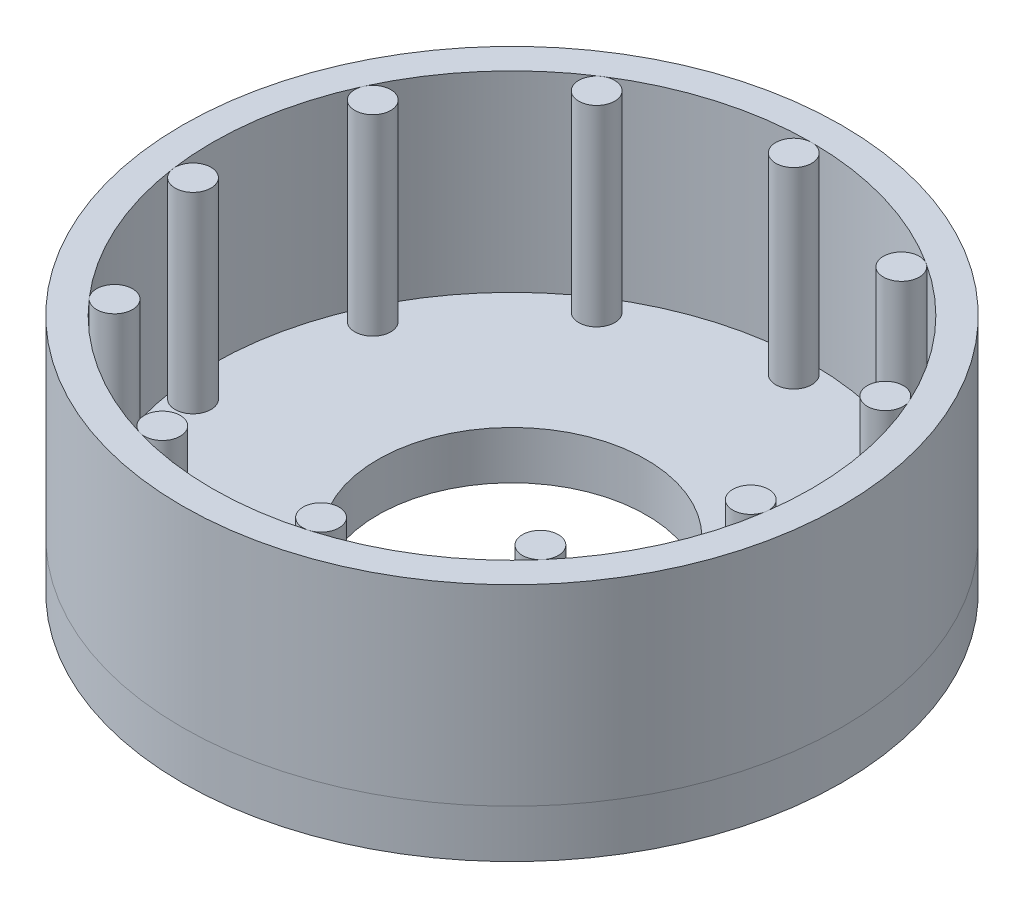
ISO-10303-21;
HEADER;
FILE_DESCRIPTION(('STEP AP214'),'2;1');
FILE_NAME('part.step','',(''),(''),'','','');
FILE_SCHEMA(('AUTOMOTIVE_DESIGN { 1 0 10303 214 1 1 1 1 }'));
ENDSEC;
DATA;
#1=APPLICATION_CONTEXT('core data for automotive mechanical design processes');
#2=APPLICATION_PROTOCOL_DEFINITION('international standard','automotive_design',2000,#1);
#3=PRODUCT_CONTEXT('',#1,'mechanical');
#4=PRODUCT('Part','Part','',(#3));
#5=PRODUCT_RELATED_PRODUCT_CATEGORY('part','',(#4));
#6=PRODUCT_DEFINITION_FORMATION('','',#4);
#7=PRODUCT_DEFINITION_CONTEXT('part definition',#1,'design');
#8=PRODUCT_DEFINITION('design','',#6,#7);
#9=PRODUCT_DEFINITION_SHAPE('','',#8);
#10=(LENGTH_UNIT() NAMED_UNIT(*) SI_UNIT(.MILLI.,.METRE.));
#11=(NAMED_UNIT(*) PLANE_ANGLE_UNIT() SI_UNIT($,.RADIAN.));
#12=(NAMED_UNIT(*) SI_UNIT($,.STERADIAN.) SOLID_ANGLE_UNIT());
#13=UNCERTAINTY_MEASURE_WITH_UNIT(LENGTH_MEASURE(1.E-05),#10,'distance_accuracy_value','');
#14=(GEOMETRIC_REPRESENTATION_CONTEXT(3) GLOBAL_UNCERTAINTY_ASSIGNED_CONTEXT((#13)) GLOBAL_UNIT_ASSIGNED_CONTEXT((#10,
#11,#12)) REPRESENTATION_CONTEXT('',''));
#15=CARTESIAN_POINT('',(0.,0.,0.));
#16=DIRECTION('',(0.,0.,1.));
#17=DIRECTION('',(1.,0.,0.));
#18=AXIS2_PLACEMENT_3D('',#15,#16,#17);
#19=CARTESIAN_POINT('',(0.,-4.,0.));
#20=DIRECTION('',(0.,1.,0.));
#21=DIRECTION('',(0.,0.,1.));
#22=AXIS2_PLACEMENT_3D('',#19,#20,#21);
#23=CYLINDRICAL_SURFACE('',#22,27.5);
#24=CARTESIAN_POINT('',(0.,-4.,0.));
#25=DIRECTION('',(0.,1.,0.));
#26=DIRECTION('',(0.,0.,1.));
#27=AXIS2_PLACEMENT_3D('',#24,#25,#26);
#28=CIRCLE('',#27,27.5);
#29=CARTESIAN_POINT('',(0.,-4.,27.5));
#30=VERTEX_POINT('',#29);
#31=EDGE_CURVE('E12',#30,#30,#28,.T.);
#32=ORIENTED_EDGE('',*,*,#31,.T.);
#33=EDGE_LOOP('',(#32));
#34=FACE_BOUND('',#33,.T.);
#35=CARTESIAN_POINT('',(0.,0.,0.));
#36=DIRECTION('',(0.,1.,0.));
#37=DIRECTION('',(0.,0.,1.));
#38=AXIS2_PLACEMENT_3D('',#35,#36,#37);
#39=CIRCLE('',#38,27.5);
#40=CARTESIAN_POINT('',(0.,0.,27.5));
#41=VERTEX_POINT('',#40);
#42=EDGE_CURVE('E123',#41,#41,#39,.T.);
#43=ORIENTED_EDGE('',*,*,#42,.F.);
#44=EDGE_LOOP('',(#43));
#45=FACE_BOUND('',#44,.T.);
#46=ADVANCED_FACE('F116',(#34,#45),#23,.T.);
#47=CARTESIAN_POINT('',(0.,-4.,0.));
#48=DIRECTION('',(0.,1.,0.));
#49=DIRECTION('',(0.,0.,1.));
#50=AXIS2_PLACEMENT_3D('',#47,#48,#49);
#51=PLANE('',#50);
#52=CARTESIAN_POINT('',(0.,-4.,0.));
#53=DIRECTION('',(0.,1.,0.));
#54=DIRECTION('',(0.,0.,1.));
#55=AXIS2_PLACEMENT_3D('',#52,#53,#54);
#56=CIRCLE('',#55,11.2);
#57=CARTESIAN_POINT('',(0.,-4.,11.2));
#58=VERTEX_POINT('',#57);
#59=EDGE_CURVE('E129',#58,#58,#56,.T.);
#60=ORIENTED_EDGE('',*,*,#59,.T.);
#61=EDGE_LOOP('',(#60));
#62=FACE_BOUND('',#61,.T.);
#63=ORIENTED_EDGE('',*,*,#31,.F.);
#64=EDGE_LOOP('',(#63));
#65=FACE_BOUND('',#64,.T.);
#66=ADVANCED_FACE('F142',(#62,#65),#51,.F.);
#67=CARTESIAN_POINT('',(0.,0.,0.));
#68=DIRECTION('',(0.,1.,0.));
#69=DIRECTION('',(0.,0.,1.));
#70=AXIS2_PLACEMENT_3D('',#67,#68,#69);
#71=PLANE('',#70);
#72=CARTESIAN_POINT('',(0.,0.,0.));
#73=DIRECTION('',(0.,1.,0.));
#74=DIRECTION('',(0.,0.,1.));
#75=AXIS2_PLACEMENT_3D('',#72,#73,#74);
#76=CIRCLE('',#75,11.2);
#77=CARTESIAN_POINT('',(0.,0.,11.2));
#78=VERTEX_POINT('',#77);
#79=EDGE_CURVE('E119',#78,#78,#76,.T.);
#80=ORIENTED_EDGE('',*,*,#79,.F.);
#81=EDGE_LOOP('',(#80));
#82=FACE_BOUND('',#81,.T.);
#83=ORIENTED_EDGE('',*,*,#42,.T.);
#84=EDGE_LOOP('',(#83));
#85=FACE_BOUND('',#84,.T.);
#86=ADVANCED_FACE('F139',(#82,#85),#71,.T.);
#87=CARTESIAN_POINT('',(0.,-4.,0.));
#88=DIRECTION('',(0.,1.,0.));
#89=DIRECTION('',(0.,0.,1.));
#90=AXIS2_PLACEMENT_3D('',#87,#88,#89);
#91=CYLINDRICAL_SURFACE('',#90,11.2);
#92=ORIENTED_EDGE('',*,*,#79,.T.);
#93=EDGE_LOOP('',(#92));
#94=FACE_BOUND('',#93,.T.);
#95=ORIENTED_EDGE('',*,*,#59,.F.);
#96=EDGE_LOOP('',(#95));
#97=FACE_BOUND('',#96,.T.);
#98=ADVANCED_FACE('F136',(#94,#97),#91,.F.);
#99=CLOSED_SHELL('',(#46,#66,#86,#98));
#100=MANIFOLD_SOLID_BREP('B2',#99);
#101=CARTESIAN_POINT('',(-23.2608038842009,16.,3.34439869942313));
#102=DIRECTION('',(0.,-1.,0.));
#103=DIRECTION('',(0.,0.,-1.));
#104=AXIS2_PLACEMENT_3D('',#101,#102,#103);
#105=CYLINDRICAL_SURFACE('',#104,1.5);
#106=CARTESIAN_POINT('',(-23.2608038842009,0.,3.34439869942313));
#107=DIRECTION('',(0.,1.,0.));
#108=DIRECTION('',(0.,0.,1.));
#109=AXIS2_PLACEMENT_3D('',#106,#107,#108);
#110=CIRCLE('',#109,1.5);
#111=CARTESIAN_POINT('',(-23.2608038842009,0.,4.84439869942313));
#112=VERTEX_POINT('',#111);
#113=EDGE_CURVE('E115',#112,#112,#110,.T.);
#114=ORIENTED_EDGE('',*,*,#113,.T.);
#115=EDGE_LOOP('',(#114));
#116=FACE_BOUND('',#115,.T.);
#117=CARTESIAN_POINT('',(-23.2608038842009,16.,3.34439869942313));
#118=DIRECTION('',(0.,1.,0.));
#119=DIRECTION('',(0.,0.,1.));
#120=AXIS2_PLACEMENT_3D('',#117,#118,#119);
#121=CIRCLE('',#120,1.5);
#122=CARTESIAN_POINT('',(-23.2608038842009,16.,4.84439869942313));
#123=VERTEX_POINT('',#122);
#124=EDGE_CURVE('E198',#123,#123,#121,.T.);
#125=ORIENTED_EDGE('',*,*,#124,.F.);
#126=EDGE_LOOP('',(#125));
#127=FACE_BOUND('',#126,.T.);
#128=ADVANCED_FACE('F194',(#116,#127),#105,.T.);
#129=CARTESIAN_POINT('',(0.,16.,0.));
#130=DIRECTION('',(0.,1.,0.));
#131=DIRECTION('',(0.,0.,1.));
#132=AXIS2_PLACEMENT_3D('',#129,#130,#131);
#133=PLANE('',#132);
#134=ORIENTED_EDGE('',*,*,#124,.T.);
#135=EDGE_LOOP('',(#134));
#136=FACE_BOUND('',#135,.T.);
#137=ADVANCED_FACE('F196',(#136),#133,.T.);
#138=CARTESIAN_POINT('',(0.,0.,0.));
#139=DIRECTION('',(0.,1.,0.));
#140=DIRECTION('',(0.,0.,1.));
#141=AXIS2_PLACEMENT_3D('',#138,#139,#140);
#142=PLANE('',#141);
#143=ORIENTED_EDGE('',*,*,#113,.F.);
#144=EDGE_LOOP('',(#143));
#145=FACE_BOUND('',#144,.T.);
#146=ADVANCED_FACE('F213',(#145),#142,.F.);
#147=CLOSED_SHELL('',(#128,#137,#146));
#148=MANIFOLD_SOLID_BREP('B7',#147);
#149=CARTESIAN_POINT('',(0.,16.,0.));
#150=DIRECTION('',(0.,-1.,0.));
#151=DIRECTION('',(0.,0.,-1.));
#152=AXIS2_PLACEMENT_3D('',#149,#150,#151);
#153=CYLINDRICAL_SURFACE('',#152,25.);
#154=CARTESIAN_POINT('',(0.,0.,0.));
#155=DIRECTION('',(0.,1.,0.));
#156=DIRECTION('',(0.,0.,1.));
#157=AXIS2_PLACEMENT_3D('',#154,#155,#156);
#158=CIRCLE('',#157,25.);
#159=CARTESIAN_POINT('',(0.,0.,25.));
#160=VERTEX_POINT('',#159);
#161=EDGE_CURVE('E193',#160,#160,#158,.T.);
#162=ORIENTED_EDGE('',*,*,#161,.F.);
#163=EDGE_LOOP('',(#162));
#164=FACE_BOUND('',#163,.T.);
#165=CARTESIAN_POINT('',(0.,16.,0.));
#166=DIRECTION('',(0.,1.,0.));
#167=DIRECTION('',(0.,0.,1.));
#168=AXIS2_PLACEMENT_3D('',#165,#166,#167);
#169=CIRCLE('',#168,25.);
#170=CARTESIAN_POINT('',(0.,16.,25.));
#171=VERTEX_POINT('',#170);
#172=EDGE_CURVE('E253',#171,#171,#169,.T.);
#173=ORIENTED_EDGE('',*,*,#172,.T.);
#174=EDGE_LOOP('',(#173));
#175=FACE_BOUND('',#174,.T.);
#176=ADVANCED_FACE('F249',(#164,#175),#153,.F.);
#177=CARTESIAN_POINT('',(0.,16.,0.));
#178=DIRECTION('',(0.,-1.,0.));
#179=DIRECTION('',(0.,0.,-1.));
#180=AXIS2_PLACEMENT_3D('',#177,#178,#179);
#181=CYLINDRICAL_SURFACE('',#180,27.5);
#182=CARTESIAN_POINT('',(0.,16.,0.));
#183=DIRECTION('',(0.,1.,0.));
#184=DIRECTION('',(0.,0.,1.));
#185=AXIS2_PLACEMENT_3D('',#182,#183,#184);
#186=CIRCLE('',#185,27.5);
#187=CARTESIAN_POINT('',(0.,16.,27.5));
#188=VERTEX_POINT('',#187);
#189=EDGE_CURVE('E263',#188,#188,#186,.T.);
#190=ORIENTED_EDGE('',*,*,#189,.F.);
#191=EDGE_LOOP('',(#190));
#192=FACE_BOUND('',#191,.T.);
#193=CARTESIAN_POINT('',(0.,0.,0.));
#194=DIRECTION('',(0.,1.,0.));
#195=DIRECTION('',(0.,0.,1.));
#196=AXIS2_PLACEMENT_3D('',#193,#194,#195);
#197=CIRCLE('',#196,27.5);
#198=CARTESIAN_POINT('',(0.,0.,27.5));
#199=VERTEX_POINT('',#198);
#200=EDGE_CURVE('E257',#199,#199,#197,.T.);
#201=ORIENTED_EDGE('',*,*,#200,.T.);
#202=EDGE_LOOP('',(#201));
#203=FACE_BOUND('',#202,.T.);
#204=ADVANCED_FACE('F273',(#192,#203),#181,.T.);
#205=CARTESIAN_POINT('',(0.,16.,0.));
#206=DIRECTION('',(0.,1.,0.));
#207=DIRECTION('',(0.,0.,1.));
#208=AXIS2_PLACEMENT_3D('',#205,#206,#207);
#209=PLANE('',#208);
#210=ORIENTED_EDGE('',*,*,#172,.F.);
#211=EDGE_LOOP('',(#210));
#212=FACE_BOUND('',#211,.T.);
#213=ORIENTED_EDGE('',*,*,#189,.T.);
#214=EDGE_LOOP('',(#213));
#215=FACE_BOUND('',#214,.T.);
#216=ADVANCED_FACE('F251',(#212,#215),#209,.T.);
#217=CARTESIAN_POINT('',(0.,0.,0.));
#218=DIRECTION('',(0.,1.,0.));
#219=DIRECTION('',(0.,0.,1.));
#220=AXIS2_PLACEMENT_3D('',#217,#218,#219);
#221=PLANE('',#220);
#222=ORIENTED_EDGE('',*,*,#161,.T.);
#223=EDGE_LOOP('',(#222));
#224=FACE_BOUND('',#223,.T.);
#225=ORIENTED_EDGE('',*,*,#200,.F.);
#226=EDGE_LOOP('',(#225));
#227=FACE_BOUND('',#226,.T.);
#228=ADVANCED_FACE('F272',(#224,#227),#221,.F.);
#229=CLOSED_SHELL('',(#176,#204,#216,#228));
#230=MANIFOLD_SOLID_BREP('B110',#229);
#231=CARTESIAN_POINT('',(23.260803884203,16.,3.34439869942127));
#232=DIRECTION('',(0.,-1.,0.));
#233=DIRECTION('',(0.,0.,-1.));
#234=AXIS2_PLACEMENT_3D('',#231,#232,#233);
#235=CYLINDRICAL_SURFACE('',#234,1.5);
#236=CARTESIAN_POINT('',(23.260803884203,0.,3.34439869942127));
#237=DIRECTION('',(0.,1.,0.));
#238=DIRECTION('',(0.,0.,1.));
#239=AXIS2_PLACEMENT_3D('',#236,#237,#238);
#240=CIRCLE('',#239,1.5);
#241=CARTESIAN_POINT('',(23.260803884203,0.,4.84439869942127));
#242=VERTEX_POINT('',#241);
#243=EDGE_CURVE('E248',#242,#242,#240,.T.);
#244=ORIENTED_EDGE('',*,*,#243,.T.);
#245=EDGE_LOOP('',(#244));
#246=FACE_BOUND('',#245,.T.);
#247=CARTESIAN_POINT('',(23.260803884203,16.,3.34439869942127));
#248=DIRECTION('',(0.,1.,0.));
#249=DIRECTION('',(0.,0.,1.));
#250=AXIS2_PLACEMENT_3D('',#247,#248,#249);
#251=CIRCLE('',#250,1.5);
#252=CARTESIAN_POINT('',(23.260803884203,16.,4.84439869942127));
#253=VERTEX_POINT('',#252);
#254=EDGE_CURVE('E481',#253,#253,#251,.T.);
#255=ORIENTED_EDGE('',*,*,#254,.F.);
#256=EDGE_LOOP('',(#255));
#257=FACE_BOUND('',#256,.T.);
#258=ADVANCED_FACE('F477',(#246,#257),#235,.T.);
#259=CARTESIAN_POINT('',(23.260803884203,16.,3.34439869942127));
#260=DIRECTION('',(0.,1.,0.));
#261=DIRECTION('',(0.,0.,1.));
#262=AXIS2_PLACEMENT_3D('',#259,#260,#261);
#263=PLANE('',#262);
#264=ORIENTED_EDGE('',*,*,#254,.T.);
#265=EDGE_LOOP('',(#264));
#266=FACE_BOUND('',#265,.T.);
#267=ADVANCED_FACE('F479',(#266),#263,.T.);
#268=CARTESIAN_POINT('',(23.260803884203,0.,3.34439869942127));
#269=DIRECTION('',(0.,1.,0.));
#270=DIRECTION('',(0.,0.,1.));
#271=AXIS2_PLACEMENT_3D('',#268,#269,#270);
#272=PLANE('',#271);
#273=ORIENTED_EDGE('',*,*,#243,.F.);
#274=EDGE_LOOP('',(#273));
#275=FACE_BOUND('',#274,.T.);
#276=ADVANCED_FACE('F496',(#275),#272,.F.);
#277=CLOSED_SHELL('',(#258,#267,#276));
#278=MANIFOLD_SOLID_BREP('B188',#277);
#279=CARTESIAN_POINT('',(-21.3763518908306,16.,-9.76225280554347));
#280=DIRECTION('',(0.,-1.,0.));
#281=DIRECTION('',(0.,0.,-1.));
#282=AXIS2_PLACEMENT_3D('',#279,#280,#281);
#283=CYLINDRICAL_SURFACE('',#282,1.5);
#284=CARTESIAN_POINT('',(-21.3763518908306,0.,-9.76225280554347));
#285=DIRECTION('',(0.,1.,0.));
#286=DIRECTION('',(0.,0.,1.));
#287=AXIS2_PLACEMENT_3D('',#284,#285,#286);
#288=CIRCLE('',#287,1.5);
#289=CARTESIAN_POINT('',(-21.3763518908306,0.,-8.26225280554347));
#290=VERTEX_POINT('',#289);
#291=EDGE_CURVE('E476',#290,#290,#288,.T.);
#292=ORIENTED_EDGE('',*,*,#291,.T.);
#293=EDGE_LOOP('',(#292));
#294=FACE_BOUND('',#293,.T.);
#295=CARTESIAN_POINT('',(-21.3763518908306,16.,-9.76225280554347));
#296=DIRECTION('',(0.,1.,0.));
#297=DIRECTION('',(0.,0.,1.));
#298=AXIS2_PLACEMENT_3D('',#295,#296,#297);
#299=CIRCLE('',#298,1.5);
#300=CARTESIAN_POINT('',(-21.3763518908306,16.,-8.26225280554347));
#301=VERTEX_POINT('',#300);
#302=EDGE_CURVE('E536',#301,#301,#299,.T.);
#303=ORIENTED_EDGE('',*,*,#302,.F.);
#304=EDGE_LOOP('',(#303));
#305=FACE_BOUND('',#304,.T.);
#306=ADVANCED_FACE('F532',(#294,#305),#283,.T.);
#307=CARTESIAN_POINT('',(0.,16.,0.));
#308=DIRECTION('',(0.,1.,0.));
#309=DIRECTION('',(0.,0.,1.));
#310=AXIS2_PLACEMENT_3D('',#307,#308,#309);
#311=PLANE('',#310);
#312=ORIENTED_EDGE('',*,*,#302,.T.);
#313=EDGE_LOOP('',(#312));
#314=FACE_BOUND('',#313,.T.);
#315=ADVANCED_FACE('F534',(#314),#311,.T.);
#316=CARTESIAN_POINT('',(0.,0.,0.));
#317=DIRECTION('',(0.,1.,0.));
#318=DIRECTION('',(0.,0.,1.));
#319=AXIS2_PLACEMENT_3D('',#316,#317,#318);
#320=PLANE('',#319);
#321=ORIENTED_EDGE('',*,*,#291,.F.);
#322=EDGE_LOOP('',(#321));
#323=FACE_BOUND('',#322,.T.);
#324=ADVANCED_FACE('F551',(#323),#320,.F.);
#325=CLOSED_SHELL('',(#306,#315,#324));
#326=MANIFOLD_SOLID_BREP('B243',#325);
#327=CARTESIAN_POINT('',(-12.7050592102064,16.,-19.7694580215323));
#328=DIRECTION('',(0.,-1.,0.));
#329=DIRECTION('',(0.,0.,-1.));
#330=AXIS2_PLACEMENT_3D('',#327,#328,#329);
#331=CYLINDRICAL_SURFACE('',#330,1.5);
#332=CARTESIAN_POINT('',(-12.7050592102064,0.,-19.7694580215323));
#333=DIRECTION('',(0.,1.,0.));
#334=DIRECTION('',(0.,0.,1.));
#335=AXIS2_PLACEMENT_3D('',#332,#333,#334);
#336=CIRCLE('',#335,1.5);
#337=CARTESIAN_POINT('',(-12.7050592102064,0.,-18.2694580215323));
#338=VERTEX_POINT('',#337);
#339=EDGE_CURVE('E531',#338,#338,#336,.T.);
#340=ORIENTED_EDGE('',*,*,#339,.T.);
#341=EDGE_LOOP('',(#340));
#342=FACE_BOUND('',#341,.T.);
#343=CARTESIAN_POINT('',(-12.7050592102064,16.,-19.7694580215323));
#344=DIRECTION('',(0.,1.,0.));
#345=DIRECTION('',(0.,0.,1.));
#346=AXIS2_PLACEMENT_3D('',#343,#344,#345);
#347=CIRCLE('',#346,1.5);
#348=CARTESIAN_POINT('',(-12.7050592102064,16.,-18.2694580215323));
#349=VERTEX_POINT('',#348);
#350=EDGE_CURVE('E591',#349,#349,#347,.T.);
#351=ORIENTED_EDGE('',*,*,#350,.F.);
#352=EDGE_LOOP('',(#351));
#353=FACE_BOUND('',#352,.T.);
#354=ADVANCED_FACE('F587',(#342,#353),#331,.T.);
#355=CARTESIAN_POINT('',(0.,16.,0.));
#356=DIRECTION('',(0.,1.,0.));
#357=DIRECTION('',(0.,0.,1.));
#358=AXIS2_PLACEMENT_3D('',#355,#356,#357);
#359=PLANE('',#358);
#360=ORIENTED_EDGE('',*,*,#350,.T.);
#361=EDGE_LOOP('',(#360));
#362=FACE_BOUND('',#361,.T.);
#363=ADVANCED_FACE('F589',(#362),#359,.T.);
#364=CARTESIAN_POINT('',(0.,0.,0.));
#365=DIRECTION('',(0.,1.,0.));
#366=DIRECTION('',(0.,0.,1.));
#367=AXIS2_PLACEMENT_3D('',#364,#365,#366);
#368=PLANE('',#367);
#369=ORIENTED_EDGE('',*,*,#339,.F.);
#370=EDGE_LOOP('',(#369));
#371=FACE_BOUND('',#370,.T.);
#372=ADVANCED_FACE('F606',(#371),#368,.F.);
#373=CLOSED_SHELL('',(#354,#363,#372));
#374=MANIFOLD_SOLID_BREP('B471',#373);
#375=CARTESIAN_POINT('',(0.,16.,-23.5));
#376=DIRECTION('',(0.,-1.,0.));
#377=DIRECTION('',(0.,0.,-1.));
#378=AXIS2_PLACEMENT_3D('',#375,#376,#377);
#379=CYLINDRICAL_SURFACE('',#378,1.5);
#380=CARTESIAN_POINT('',(0.,0.,-23.5));
#381=DIRECTION('',(0.,1.,0.));
#382=DIRECTION('',(0.,0.,1.));
#383=AXIS2_PLACEMENT_3D('',#380,#381,#382);
#384=CIRCLE('',#383,1.5);
#385=CARTESIAN_POINT('',(0.,0.,-22.));
#386=VERTEX_POINT('',#385);
#387=EDGE_CURVE('E586',#386,#386,#384,.T.);
#388=ORIENTED_EDGE('',*,*,#387,.T.);
#389=EDGE_LOOP('',(#388));
#390=FACE_BOUND('',#389,.T.);
#391=CARTESIAN_POINT('',(0.,16.,-23.5));
#392=DIRECTION('',(0.,1.,0.));
#393=DIRECTION('',(0.,0.,1.));
#394=AXIS2_PLACEMENT_3D('',#391,#392,#393);
#395=CIRCLE('',#394,1.5);
#396=CARTESIAN_POINT('',(0.,16.,-22.));
#397=VERTEX_POINT('',#396);
#398=EDGE_CURVE('E646',#397,#397,#395,.T.);
#399=ORIENTED_EDGE('',*,*,#398,.F.);
#400=EDGE_LOOP('',(#399));
#401=FACE_BOUND('',#400,.T.);
#402=ADVANCED_FACE('F642',(#390,#401),#379,.T.);
#403=CARTESIAN_POINT('',(0.,16.,0.));
#404=DIRECTION('',(0.,1.,0.));
#405=DIRECTION('',(0.,0.,1.));
#406=AXIS2_PLACEMENT_3D('',#403,#404,#405);
#407=PLANE('',#406);
#408=ORIENTED_EDGE('',*,*,#398,.T.);
#409=EDGE_LOOP('',(#408));
#410=FACE_BOUND('',#409,.T.);
#411=ADVANCED_FACE('F644',(#410),#407,.T.);
#412=CARTESIAN_POINT('',(0.,0.,0.));
#413=DIRECTION('',(0.,1.,0.));
#414=DIRECTION('',(0.,0.,1.));
#415=AXIS2_PLACEMENT_3D('',#412,#413,#414);
#416=PLANE('',#415);
#417=ORIENTED_EDGE('',*,*,#387,.F.);
#418=EDGE_LOOP('',(#417));
#419=FACE_BOUND('',#418,.T.);
#420=ADVANCED_FACE('F661',(#419),#416,.F.);
#421=CLOSED_SHELL('',(#402,#411,#420));
#422=MANIFOLD_SOLID_BREP('B526',#421);
#423=CARTESIAN_POINT('',(12.7050592102067,16.,-19.7694580215333));
#424=DIRECTION('',(0.,-1.,0.));
#425=DIRECTION('',(0.,0.,-1.));
#426=AXIS2_PLACEMENT_3D('',#423,#424,#425);
#427=CYLINDRICAL_SURFACE('',#426,1.5);
#428=CARTESIAN_POINT('',(12.7050592102067,0.,-19.7694580215333));
#429=DIRECTION('',(0.,1.,0.));
#430=DIRECTION('',(0.,0.,1.));
#431=AXIS2_PLACEMENT_3D('',#428,#429,#430);
#432=CIRCLE('',#431,1.5);
#433=CARTESIAN_POINT('',(12.7050592102067,0.,-18.2694580215333));
#434=VERTEX_POINT('',#433);
#435=EDGE_CURVE('E641',#434,#434,#432,.T.);
#436=ORIENTED_EDGE('',*,*,#435,.T.);
#437=EDGE_LOOP('',(#436));
#438=FACE_BOUND('',#437,.T.);
#439=CARTESIAN_POINT('',(12.7050592102067,16.,-19.7694580215333));
#440=DIRECTION('',(0.,1.,0.));
#441=DIRECTION('',(0.,0.,1.));
#442=AXIS2_PLACEMENT_3D('',#439,#440,#441);
#443=CIRCLE('',#442,1.5);
#444=CARTESIAN_POINT('',(12.7050592102067,16.,-18.2694580215333));
#445=VERTEX_POINT('',#444);
#446=EDGE_CURVE('E701',#445,#445,#443,.T.);
#447=ORIENTED_EDGE('',*,*,#446,.F.);
#448=EDGE_LOOP('',(#447));
#449=FACE_BOUND('',#448,.T.);
#450=ADVANCED_FACE('F697',(#438,#449),#427,.T.);
#451=CARTESIAN_POINT('',(0.,16.,0.));
#452=DIRECTION('',(0.,1.,0.));
#453=DIRECTION('',(0.,0.,1.));
#454=AXIS2_PLACEMENT_3D('',#451,#452,#453);
#455=PLANE('',#454);
#456=ORIENTED_EDGE('',*,*,#446,.T.);
#457=EDGE_LOOP('',(#456));
#458=FACE_BOUND('',#457,.T.);
#459=ADVANCED_FACE('F699',(#458),#455,.T.);
#460=CARTESIAN_POINT('',(0.,0.,0.));
#461=DIRECTION('',(0.,1.,0.));
#462=DIRECTION('',(0.,0.,1.));
#463=AXIS2_PLACEMENT_3D('',#460,#461,#462);
#464=PLANE('',#463);
#465=ORIENTED_EDGE('',*,*,#435,.F.);
#466=EDGE_LOOP('',(#465));
#467=FACE_BOUND('',#466,.T.);
#468=ADVANCED_FACE('F716',(#467),#464,.F.);
#469=CLOSED_SHELL('',(#450,#459,#468));
#470=MANIFOLD_SOLID_BREP('B581',#469);
#471=CARTESIAN_POINT('',(21.3763518908317,16.,-9.76225280554518));
#472=DIRECTION('',(0.,-1.,0.));
#473=DIRECTION('',(0.,0.,-1.));
#474=AXIS2_PLACEMENT_3D('',#471,#472,#473);
#475=CYLINDRICAL_SURFACE('',#474,1.5);
#476=CARTESIAN_POINT('',(21.3763518908317,0.,-9.76225280554518));
#477=DIRECTION('',(0.,1.,0.));
#478=DIRECTION('',(0.,0.,1.));
#479=AXIS2_PLACEMENT_3D('',#476,#477,#478);
#480=CIRCLE('',#479,1.5);
#481=CARTESIAN_POINT('',(21.3763518908317,0.,-8.26225280554518));
#482=VERTEX_POINT('',#481);
#483=EDGE_CURVE('E696',#482,#482,#480,.T.);
#484=ORIENTED_EDGE('',*,*,#483,.T.);
#485=EDGE_LOOP('',(#484));
#486=FACE_BOUND('',#485,.T.);
#487=CARTESIAN_POINT('',(21.3763518908317,16.,-9.76225280554518));
#488=DIRECTION('',(0.,1.,0.));
#489=DIRECTION('',(0.,0.,1.));
#490=AXIS2_PLACEMENT_3D('',#487,#488,#489);
#491=CIRCLE('',#490,1.5);
#492=CARTESIAN_POINT('',(21.3763518908317,16.,-8.26225280554518));
#493=VERTEX_POINT('',#492);
#494=EDGE_CURVE('E756',#493,#493,#491,.T.);
#495=ORIENTED_EDGE('',*,*,#494,.F.);
#496=EDGE_LOOP('',(#495));
#497=FACE_BOUND('',#496,.T.);
#498=ADVANCED_FACE('F752',(#486,#497),#475,.T.);
#499=CARTESIAN_POINT('',(0.,16.,0.));
#500=DIRECTION('',(0.,1.,0.));
#501=DIRECTION('',(0.,0.,1.));
#502=AXIS2_PLACEMENT_3D('',#499,#500,#501);
#503=PLANE('',#502);
#504=ORIENTED_EDGE('',*,*,#494,.T.);
#505=EDGE_LOOP('',(#504));
#506=FACE_BOUND('',#505,.T.);
#507=ADVANCED_FACE('F754',(#506),#503,.T.);
#508=CARTESIAN_POINT('',(0.,0.,0.));
#509=DIRECTION('',(0.,1.,0.));
#510=DIRECTION('',(0.,0.,1.));
#511=AXIS2_PLACEMENT_3D('',#508,#509,#510);
#512=PLANE('',#511);
#513=ORIENTED_EDGE('',*,*,#483,.F.);
#514=EDGE_LOOP('',(#513));
#515=FACE_BOUND('',#514,.T.);
#516=ADVANCED_FACE('F771',(#515),#512,.F.);
#517=CLOSED_SHELL('',(#498,#507,#516));
#518=MANIFOLD_SOLID_BREP('B636',#517);
#519=CARTESIAN_POINT('',(17.7601149973266,16.,15.3892272477135));
#520=DIRECTION('',(0.,-1.,0.));
#521=DIRECTION('',(0.,0.,-1.));
#522=AXIS2_PLACEMENT_3D('',#519,#520,#521);
#523=CYLINDRICAL_SURFACE('',#522,1.5);
#524=CARTESIAN_POINT('',(17.7601149973266,0.,15.3892272477135));
#525=DIRECTION('',(0.,1.,0.));
#526=DIRECTION('',(0.,0.,1.));
#527=AXIS2_PLACEMENT_3D('',#524,#525,#526);
#528=CIRCLE('',#527,1.5);
#529=CARTESIAN_POINT('',(17.7601149973266,0.,16.8892272477135));
#530=VERTEX_POINT('',#529);
#531=EDGE_CURVE('E751',#530,#530,#528,.T.);
#532=ORIENTED_EDGE('',*,*,#531,.T.);
#533=EDGE_LOOP('',(#532));
#534=FACE_BOUND('',#533,.T.);
#535=CARTESIAN_POINT('',(17.7601149973266,16.,15.3892272477135));
#536=DIRECTION('',(0.,1.,0.));
#537=DIRECTION('',(0.,0.,1.));
#538=AXIS2_PLACEMENT_3D('',#535,#536,#537);
#539=CIRCLE('',#538,1.5);
#540=CARTESIAN_POINT('',(17.7601149973266,16.,16.8892272477135));
#541=VERTEX_POINT('',#540);
#542=EDGE_CURVE('E811',#541,#541,#539,.T.);
#543=ORIENTED_EDGE('',*,*,#542,.F.);
#544=EDGE_LOOP('',(#543));
#545=FACE_BOUND('',#544,.T.);
#546=ADVANCED_FACE('F807',(#534,#545),#523,.T.);
#547=CARTESIAN_POINT('',(0.,16.,0.));
#548=DIRECTION('',(0.,1.,0.));
#549=DIRECTION('',(0.,0.,1.));
#550=AXIS2_PLACEMENT_3D('',#547,#548,#549);
#551=PLANE('',#550);
#552=ORIENTED_EDGE('',*,*,#542,.T.);
#553=EDGE_LOOP('',(#552));
#554=FACE_BOUND('',#553,.T.);
#555=ADVANCED_FACE('F809',(#554),#551,.T.);
#556=CARTESIAN_POINT('',(0.,0.,0.));
#557=DIRECTION('',(0.,1.,0.));
#558=DIRECTION('',(0.,0.,1.));
#559=AXIS2_PLACEMENT_3D('',#556,#557,#558);
#560=PLANE('',#559);
#561=ORIENTED_EDGE('',*,*,#531,.F.);
#562=EDGE_LOOP('',(#561));
#563=FACE_BOUND('',#562,.T.);
#564=ADVANCED_FACE('F826',(#563),#560,.F.);
#565=CLOSED_SHELL('',(#546,#555,#564));
#566=MANIFOLD_SOLID_BREP('B691',#565);
#567=CARTESIAN_POINT('',(6.62071508577543,16.,22.5480848799404));
#568=DIRECTION('',(0.,-1.,0.));
#569=DIRECTION('',(0.,0.,-1.));
#570=AXIS2_PLACEMENT_3D('',#567,#568,#569);
#571=CYLINDRICAL_SURFACE('',#570,1.5);
#572=CARTESIAN_POINT('',(6.62071508577543,0.,22.5480848799404));
#573=DIRECTION('',(0.,1.,0.));
#574=DIRECTION('',(0.,0.,1.));
#575=AXIS2_PLACEMENT_3D('',#572,#573,#574);
#576=CIRCLE('',#575,1.5);
#577=CARTESIAN_POINT('',(6.62071508577543,0.,24.0480848799404));
#578=VERTEX_POINT('',#577);
#579=EDGE_CURVE('E806',#578,#578,#576,.T.);
#580=ORIENTED_EDGE('',*,*,#579,.T.);
#581=EDGE_LOOP('',(#580));
#582=FACE_BOUND('',#581,.T.);
#583=CARTESIAN_POINT('',(6.62071508577543,16.,22.5480848799404));
#584=DIRECTION('',(0.,1.,0.));
#585=DIRECTION('',(0.,0.,1.));
#586=AXIS2_PLACEMENT_3D('',#583,#584,#585);
#587=CIRCLE('',#586,1.5);
#588=CARTESIAN_POINT('',(6.62071508577543,16.,24.0480848799404));
#589=VERTEX_POINT('',#588);
#590=EDGE_CURVE('E866',#589,#589,#587,.T.);
#591=ORIENTED_EDGE('',*,*,#590,.F.);
#592=EDGE_LOOP('',(#591));
#593=FACE_BOUND('',#592,.T.);
#594=ADVANCED_FACE('F862',(#582,#593),#571,.T.);
#595=CARTESIAN_POINT('',(0.,16.,0.));
#596=DIRECTION('',(0.,1.,0.));
#597=DIRECTION('',(0.,0.,1.));
#598=AXIS2_PLACEMENT_3D('',#595,#596,#597);
#599=PLANE('',#598);
#600=ORIENTED_EDGE('',*,*,#590,.T.);
#601=EDGE_LOOP('',(#600));
#602=FACE_BOUND('',#601,.T.);
#603=ADVANCED_FACE('F864',(#602),#599,.T.);
#604=CARTESIAN_POINT('',(0.,0.,0.));
#605=DIRECTION('',(0.,1.,0.));
#606=DIRECTION('',(0.,0.,1.));
#607=AXIS2_PLACEMENT_3D('',#604,#605,#606);
#608=PLANE('',#607);
#609=ORIENTED_EDGE('',*,*,#579,.F.);
#610=EDGE_LOOP('',(#609));
#611=FACE_BOUND('',#610,.T.);
#612=ADVANCED_FACE('F881',(#611),#608,.F.);
#613=CLOSED_SHELL('',(#594,#603,#612));
#614=MANIFOLD_SOLID_BREP('B746',#613);
#615=CARTESIAN_POINT('',(-6.62071508577176,16.,22.548084879941));
#616=DIRECTION('',(0.,-1.,0.));
#617=DIRECTION('',(0.,0.,-1.));
#618=AXIS2_PLACEMENT_3D('',#615,#616,#617);
#619=CYLINDRICAL_SURFACE('',#618,1.5);
#620=CARTESIAN_POINT('',(-6.62071508577176,0.,22.548084879941));
#621=DIRECTION('',(0.,1.,0.));
#622=DIRECTION('',(0.,0.,1.));
#623=AXIS2_PLACEMENT_3D('',#620,#621,#622);
#624=CIRCLE('',#623,1.5);
#625=CARTESIAN_POINT('',(-6.62071508577176,0.,24.048084879941));
#626=VERTEX_POINT('',#625);
#627=EDGE_CURVE('E861',#626,#626,#624,.T.);
#628=ORIENTED_EDGE('',*,*,#627,.T.);
#629=EDGE_LOOP('',(#628));
#630=FACE_BOUND('',#629,.T.);
#631=CARTESIAN_POINT('',(-6.62071508577176,16.,22.548084879941));
#632=DIRECTION('',(0.,1.,0.));
#633=DIRECTION('',(0.,0.,1.));
#634=AXIS2_PLACEMENT_3D('',#631,#632,#633);
#635=CIRCLE('',#634,1.5);
#636=CARTESIAN_POINT('',(-6.62071508577176,16.,24.048084879941));
#637=VERTEX_POINT('',#636);
#638=EDGE_CURVE('E920',#637,#637,#635,.T.);
#639=ORIENTED_EDGE('',*,*,#638,.F.);
#640=EDGE_LOOP('',(#639));
#641=FACE_BOUND('',#640,.T.);
#642=ADVANCED_FACE('F916',(#630,#641),#619,.T.);
#643=CARTESIAN_POINT('',(0.,16.,0.));
#644=DIRECTION('',(0.,1.,0.));
#645=DIRECTION('',(0.,0.,1.));
#646=AXIS2_PLACEMENT_3D('',#643,#644,#645);
#647=PLANE('',#646);
#648=ORIENTED_EDGE('',*,*,#638,.T.);
#649=EDGE_LOOP('',(#648));
#650=FACE_BOUND('',#649,.T.);
#651=ADVANCED_FACE('F918',(#650),#647,.T.);
#652=CARTESIAN_POINT('',(0.,0.,0.));
#653=DIRECTION('',(0.,1.,0.));
#654=DIRECTION('',(0.,0.,1.));
#655=AXIS2_PLACEMENT_3D('',#652,#653,#654);
#656=PLANE('',#655);
#657=ORIENTED_EDGE('',*,*,#627,.F.);
#658=EDGE_LOOP('',(#657));
#659=FACE_BOUND('',#658,.T.);
#660=ADVANCED_FACE('F935',(#659),#656,.F.);
#661=CLOSED_SHELL('',(#642,#651,#660));
#662=MANIFOLD_SOLID_BREP('B801',#661);
#663=CARTESIAN_POINT('',(-17.7601149973235,16.,15.3892272477149));
#664=DIRECTION('',(0.,-1.,0.));
#665=DIRECTION('',(0.,0.,-1.));
#666=AXIS2_PLACEMENT_3D('',#663,#664,#665);
#667=CYLINDRICAL_SURFACE('',#666,1.5);
#668=CARTESIAN_POINT('',(-17.7601149973235,0.,15.3892272477149));
#669=DIRECTION('',(0.,1.,0.));
#670=DIRECTION('',(0.,0.,1.));
#671=AXIS2_PLACEMENT_3D('',#668,#669,#670);
#672=CIRCLE('',#671,1.5);
#673=CARTESIAN_POINT('',(-17.7601149973235,0.,16.8892272477149));
#674=VERTEX_POINT('',#673);
#675=EDGE_CURVE('E966',#674,#674,#672,.T.);
#676=ORIENTED_EDGE('',*,*,#675,.T.);
#677=EDGE_LOOP('',(#676));
#678=FACE_BOUND('',#677,.T.);
#679=CARTESIAN_POINT('',(-17.7601149973235,16.,15.3892272477149));
#680=DIRECTION('',(0.,1.,0.));
#681=DIRECTION('',(0.,0.,1.));
#682=AXIS2_PLACEMENT_3D('',#679,#680,#681);
#683=CIRCLE('',#682,1.5);
#684=CARTESIAN_POINT('',(-17.7601149973235,16.,16.8892272477149));
#685=VERTEX_POINT('',#684);
#686=EDGE_CURVE('E915',#685,#685,#683,.T.);
#687=ORIENTED_EDGE('',*,*,#686,.F.);
#688=EDGE_LOOP('',(#687));
#689=FACE_BOUND('',#688,.T.);
#690=ADVANCED_FACE('F963',(#678,#689),#667,.T.);
#691=CARTESIAN_POINT('',(0.,16.,0.));
#692=DIRECTION('',(0.,1.,0.));
#693=DIRECTION('',(0.,0.,1.));
#694=AXIS2_PLACEMENT_3D('',#691,#692,#693);
#695=PLANE('',#694);
#696=ORIENTED_EDGE('',*,*,#686,.T.);
#697=EDGE_LOOP('',(#696));
#698=FACE_BOUND('',#697,.T.);
#699=ADVANCED_FACE('F979',(#698),#695,.T.);
#700=CARTESIAN_POINT('',(0.,0.,0.));
#701=DIRECTION('',(0.,1.,0.));
#702=DIRECTION('',(0.,0.,1.));
#703=AXIS2_PLACEMENT_3D('',#700,#701,#702);
#704=PLANE('',#703);
#705=ORIENTED_EDGE('',*,*,#675,.F.);
#706=EDGE_LOOP('',(#705));
#707=FACE_BOUND('',#706,.T.);
#708=ADVANCED_FACE('F977',(#707),#704,.F.);
#709=CLOSED_SHELL('',(#690,#699,#708));
#710=MANIFOLD_SOLID_BREP('B856',#709);
#711=ADVANCED_BREP_SHAPE_REPRESENTATION('',(#18,#100,#148,#230,#278,#326,#374,#422,#470,#518,
#566,#614,#662,#710),#14);
#712=SHAPE_DEFINITION_REPRESENTATION(#9,#711);
ENDSEC;
END-ISO-10303-21;
